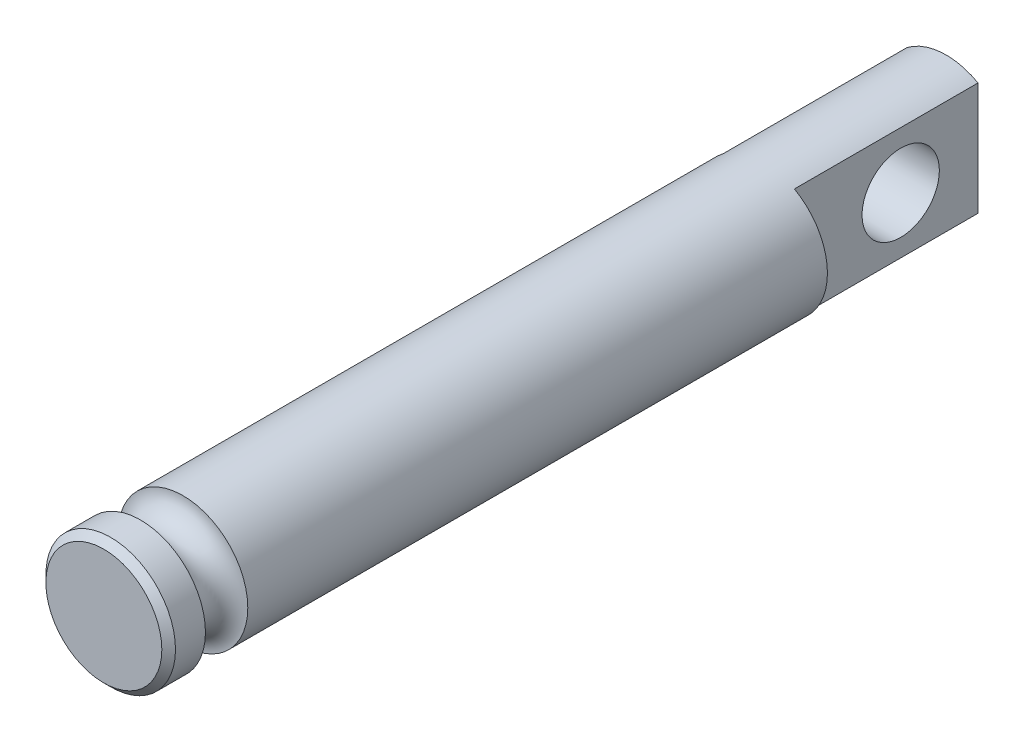
ISO-10303-21;
HEADER;
FILE_DESCRIPTION(('STEP AP214'),'2;1');
FILE_NAME('part.step','',(''),(''),'','','');
FILE_SCHEMA(('AUTOMOTIVE_DESIGN { 1 0 10303 214 1 1 1 1 }'));
ENDSEC;
DATA;
#1=APPLICATION_CONTEXT('core data for automotive mechanical design processes');
#2=APPLICATION_PROTOCOL_DEFINITION('international standard','automotive_design',2000,#1);
#3=PRODUCT_CONTEXT('',#1,'mechanical');
#4=PRODUCT('Part','Part','',(#3));
#5=PRODUCT_RELATED_PRODUCT_CATEGORY('part','',(#4));
#6=PRODUCT_DEFINITION_FORMATION('','',#4);
#7=PRODUCT_DEFINITION_CONTEXT('part definition',#1,'design');
#8=PRODUCT_DEFINITION('design','',#6,#7);
#9=PRODUCT_DEFINITION_SHAPE('','',#8);
#10=(LENGTH_UNIT() NAMED_UNIT(*) SI_UNIT(.MILLI.,.METRE.));
#11=(NAMED_UNIT(*) PLANE_ANGLE_UNIT() SI_UNIT($,.RADIAN.));
#12=(NAMED_UNIT(*) SI_UNIT($,.STERADIAN.) SOLID_ANGLE_UNIT());
#13=UNCERTAINTY_MEASURE_WITH_UNIT(LENGTH_MEASURE(1.E-05),#10,'distance_accuracy_value','');
#14=(GEOMETRIC_REPRESENTATION_CONTEXT(3) GLOBAL_UNCERTAINTY_ASSIGNED_CONTEXT((#13)) GLOBAL_UNIT_ASSIGNED_CONTEXT((#10,
#11,#12)) REPRESENTATION_CONTEXT('',''));
#15=CARTESIAN_POINT('',(0.,0.,0.));
#16=DIRECTION('',(0.,0.,1.));
#17=DIRECTION('',(1.,0.,0.));
#18=AXIS2_PLACEMENT_3D('',#15,#16,#17);
#19=CARTESIAN_POINT('',(0.,0.,-87.1911007130688));
#20=DIRECTION('',(0.,0.,1.));
#21=DIRECTION('',(1.,0.,0.));
#22=AXIS2_PLACEMENT_3D('',#19,#20,#21);
#23=PLANE('',#22);
#24=CARTESIAN_POINT('',(0.,0.,-87.1911007130688));
#25=DIRECTION('',(0.,0.,1.));
#26=DIRECTION('',(1.,0.,0.));
#27=AXIS2_PLACEMENT_3D('',#24,#25,#26);
#28=CIRCLE('',#27,6.70710678118655);
#29=CARTESIAN_POINT('',(3.29289321881345,5.8431272126945,-87.1911007130688));
#30=VERTEX_POINT('',#29);
#31=CARTESIAN_POINT('',(-4.05710678118655,5.34089561218798,-87.1911007130688));
#32=VERTEX_POINT('',#31);
#33=EDGE_CURVE('E96',#30,#32,#28,.T.);
#34=ORIENTED_EDGE('',*,*,#33,.F.);
#35=DIRECTION('',(0.,1.,0.));
#36=VECTOR('',#35,1.);
#37=CARTESIAN_POINT('',(3.29289321881345,-6.70710678118655,-87.1911007130688));
#38=LINE('',#37,#36);
#39=CARTESIAN_POINT('',(3.29289321881345,-5.8431272126945,-87.1911007130688));
#40=VERTEX_POINT('',#39);
#41=EDGE_CURVE('E59',#40,#30,#38,.T.);
#42=ORIENTED_EDGE('',*,*,#41,.F.);
#43=CARTESIAN_POINT('',(-4.05710678118655,-5.34089561218798,-87.1911007130688));
#44=VERTEX_POINT('',#43);
#45=EDGE_CURVE('E92',#44,#40,#28,.T.);
#46=ORIENTED_EDGE('',*,*,#45,.F.);
#47=DIRECTION('',(0.,1.,0.));
#48=VECTOR('',#47,1.);
#49=CARTESIAN_POINT('',(-4.05710678118655,-6.70710678118655,-87.1911007130688));
#50=LINE('',#49,#48);
#51=EDGE_CURVE('E76',#44,#32,#50,.T.);
#52=ORIENTED_EDGE('',*,*,#51,.T.);
#53=EDGE_LOOP('',(#34,#42,#46,#52));
#54=FACE_BOUND('',#53,.T.);
#55=ADVANCED_FACE('F36',(#54),#23,.F.);
#56=CARTESIAN_POINT('',(0.,0.,0.));
#57=DIRECTION('',(0.,0.,1.));
#58=DIRECTION('',(1.,0.,0.));
#59=AXIS2_PLACEMENT_3D('',#56,#57,#58);
#60=CYLINDRICAL_SURFACE('',#59,6.70710678118655);
#61=CARTESIAN_POINT('',(0.,0.,-8.19110071306884));
#62=DIRECTION('',(0.,0.,1.));
#63=DIRECTION('',(1.,0.,0.));
#64=AXIS2_PLACEMENT_3D('',#61,#62,#63);
#65=CIRCLE('',#64,6.70710678118655);
#66=CARTESIAN_POINT('',(6.70710678118655,0.,-8.19110071306884));
#67=VERTEX_POINT('',#66);
#68=EDGE_CURVE('E97',#67,#67,#65,.T.);
#69=ORIENTED_EDGE('',*,*,#68,.F.);
#70=EDGE_LOOP('',(#69));
#71=FACE_BOUND('',#70,.T.);
#72=CARTESIAN_POINT('',(0.,0.,-68.1911007130688));
#73=DIRECTION('',(0.,0.,-1.));
#74=DIRECTION('',(-1.,0.,0.));
#75=AXIS2_PLACEMENT_3D('',#72,#73,#74);
#76=CIRCLE('',#75,6.70710678118655);
#77=CARTESIAN_POINT('',(3.29289321881345,5.84312721269449,-68.1911007130688));
#78=VERTEX_POINT('',#77);
#79=CARTESIAN_POINT('',(3.29289321881345,-5.84312721269449,-68.1911007130688));
#80=VERTEX_POINT('',#79);
#81=EDGE_CURVE('E94',#78,#80,#76,.T.);
#82=ORIENTED_EDGE('',*,*,#81,.F.);
#83=DIRECTION('',(0.,0.,1.));
#84=VECTOR('',#83,1.);
#85=CARTESIAN_POINT('',(3.29289321881346,5.84312721269449,0.));
#86=LINE('',#85,#84);
#87=EDGE_CURVE('E11',#78,#30,#86,.F.);
#88=ORIENTED_EDGE('',*,*,#87,.T.);
#89=ORIENTED_EDGE('',*,*,#33,.T.);
#90=DIRECTION('',(0.,0.,1.));
#91=VECTOR('',#90,1.);
#92=CARTESIAN_POINT('',(-4.05710678118653,5.34089561218798,0.));
#93=LINE('',#92,#91);
#94=CARTESIAN_POINT('',(-4.05710678118653,5.34089561218798,-68.1911007130688));
#95=VERTEX_POINT('',#94);
#96=EDGE_CURVE('E81',#95,#32,#93,.F.);
#97=ORIENTED_EDGE('',*,*,#96,.F.);
#98=CARTESIAN_POINT('',(0.,0.,-68.1911007130688));
#99=DIRECTION('',(0.,0.,1.));
#100=DIRECTION('',(1.,0.,0.));
#101=AXIS2_PLACEMENT_3D('',#98,#99,#100);
#102=CIRCLE('',#101,6.70710678118655);
#103=CARTESIAN_POINT('',(-4.05710678118655,-5.34089561218798,-68.1911007130688));
#104=VERTEX_POINT('',#103);
#105=EDGE_CURVE('E93',#95,#104,#102,.T.);
#106=ORIENTED_EDGE('',*,*,#105,.T.);
#107=DIRECTION('',(0.,0.,1.));
#108=VECTOR('',#107,1.);
#109=CARTESIAN_POINT('',(-4.05710678118653,-5.34089561218798,0.));
#110=LINE('',#109,#108);
#111=EDGE_CURVE('E79',#44,#104,#110,.T.);
#112=ORIENTED_EDGE('',*,*,#111,.F.);
#113=ORIENTED_EDGE('',*,*,#45,.T.);
#114=DIRECTION('',(0.,0.,1.));
#115=VECTOR('',#114,1.);
#116=CARTESIAN_POINT('',(3.29289321881346,-5.84312721269449,0.));
#117=LINE('',#116,#115);
#118=EDGE_CURVE('E44',#40,#80,#117,.T.);
#119=ORIENTED_EDGE('',*,*,#118,.T.);
#120=EDGE_LOOP('',(#82,#88,#89,#97,#106,#112,#113,#119));
#121=FACE_BOUND('',#120,.T.);
#122=ADVANCED_FACE('F90',(#71,#121),#60,.T.);
#123=CARTESIAN_POINT('',(0.,0.,-6.));
#124=DIRECTION('',(0.,0.,1.));
#125=DIRECTION('',(1.,0.,0.));
#126=AXIS2_PLACEMENT_3D('',#123,#124,#125);
#127=TOROIDAL_SURFACE('',#126,6.70710678118655,2.19110071306884);
#128=CARTESIAN_POINT('',(0.,0.,-3.80889928693116));
#129=DIRECTION('',(0.,0.,1.));
#130=DIRECTION('',(1.,0.,0.));
#131=AXIS2_PLACEMENT_3D('',#128,#129,#130);
#132=CIRCLE('',#131,6.70710678118655);
#133=CARTESIAN_POINT('',(6.70710678118655,0.,-3.80889928693116));
#134=VERTEX_POINT('',#133);
#135=EDGE_CURVE('E100',#134,#134,#132,.T.);
#136=ORIENTED_EDGE('',*,*,#135,.F.);
#137=EDGE_LOOP('',(#136));
#138=FACE_BOUND('',#137,.T.);
#139=ORIENTED_EDGE('',*,*,#68,.T.);
#140=EDGE_LOOP('',(#139));
#141=FACE_BOUND('',#140,.T.);
#142=ADVANCED_FACE('F127',(#138,#141),#127,.F.);
#143=CARTESIAN_POINT('',(0.,0.,0.));
#144=DIRECTION('',(0.,0.,1.));
#145=DIRECTION('',(1.,0.,0.));
#146=AXIS2_PLACEMENT_3D('',#143,#144,#145);
#147=CYLINDRICAL_SURFACE('',#146,6.70710678118655);
#148=CARTESIAN_POINT('',(0.,0.,-0.707106781186547));
#149=DIRECTION('',(0.,0.,1.));
#150=DIRECTION('',(1.,0.,0.));
#151=AXIS2_PLACEMENT_3D('',#148,#149,#150);
#152=CIRCLE('',#151,6.70710678118655);
#153=CARTESIAN_POINT('',(6.70710678118655,0.,-0.707106781186547));
#154=VERTEX_POINT('',#153);
#155=EDGE_CURVE('E115',#154,#154,#152,.T.);
#156=ORIENTED_EDGE('',*,*,#155,.F.);
#157=EDGE_LOOP('',(#156));
#158=FACE_BOUND('',#157,.T.);
#159=ORIENTED_EDGE('',*,*,#135,.T.);
#160=EDGE_LOOP('',(#159));
#161=FACE_BOUND('',#160,.T.);
#162=ADVANCED_FACE('F125',(#158,#161),#147,.T.);
#163=CARTESIAN_POINT('',(0.,0.,-0.707106781186547));
#164=DIRECTION('',(0.,0.,-1.));
#165=DIRECTION('',(-1.,0.,0.));
#166=AXIS2_PLACEMENT_3D('',#163,#164,#165);
#167=CONICAL_SURFACE('',#166,6.70710678118655,0.785398163397451);
#168=CARTESIAN_POINT('',(0.,0.,0.));
#169=DIRECTION('',(0.,0.,1.));
#170=DIRECTION('',(1.,0.,0.));
#171=AXIS2_PLACEMENT_3D('',#168,#169,#170);
#172=CIRCLE('',#171,6.);
#173=CARTESIAN_POINT('',(6.,0.,0.));
#174=VERTEX_POINT('',#173);
#175=EDGE_CURVE('E112',#174,#174,#172,.T.);
#176=ORIENTED_EDGE('',*,*,#175,.F.);
#177=EDGE_LOOP('',(#176));
#178=FACE_BOUND('',#177,.T.);
#179=ORIENTED_EDGE('',*,*,#155,.T.);
#180=EDGE_LOOP('',(#179));
#181=FACE_BOUND('',#180,.T.);
#182=ADVANCED_FACE('F140',(#178,#181),#167,.T.);
#183=CARTESIAN_POINT('',(0.,0.,0.));
#184=DIRECTION('',(0.,0.,-1.));
#185=DIRECTION('',(-1.,0.,0.));
#186=AXIS2_PLACEMENT_3D('',#183,#184,#185);
#187=PLANE('',#186);
#188=ORIENTED_EDGE('',*,*,#175,.T.);
#189=EDGE_LOOP('',(#188));
#190=FACE_BOUND('',#189,.T.);
#191=ADVANCED_FACE('F144',(#190),#187,.F.);
#192=CARTESIAN_POINT('',(-6.70710678118655,-6.70710678118655,-68.1911007130688));
#193=DIRECTION('',(0.,0.,1.));
#194=DIRECTION('',(1.,0.,0.));
#195=AXIS2_PLACEMENT_3D('',#192,#193,#194);
#196=PLANE('',#195);
#197=DIRECTION('',(0.,1.,0.));
#198=VECTOR('',#197,1.);
#199=CARTESIAN_POINT('',(-4.05710678118655,-6.70710678118655,-68.1911007130688));
#200=LINE('',#199,#198);
#201=EDGE_CURVE('E51',#104,#95,#200,.T.);
#202=ORIENTED_EDGE('',*,*,#201,.F.);
#203=ORIENTED_EDGE('',*,*,#105,.F.);
#204=EDGE_LOOP('',(#202,#203));
#205=FACE_BOUND('',#204,.T.);
#206=ADVANCED_FACE('F148',(#205),#196,.F.);
#207=CARTESIAN_POINT('',(-4.05710678118655,-6.70710678118655,-87.1911007130688));
#208=DIRECTION('',(-1.,0.,0.));
#209=DIRECTION('',(0.,0.,1.));
#210=AXIS2_PLACEMENT_3D('',#207,#208,#209);
#211=PLANE('',#210);
#212=CARTESIAN_POINT('',(-4.05710678118655,0.,-79.1911007130688));
#213=DIRECTION('',(-1.,0.,0.));
#214=DIRECTION('',(0.,0.,1.));
#215=AXIS2_PLACEMENT_3D('',#212,#213,#214);
#216=CIRCLE('',#215,4.00000000000001);
#217=CARTESIAN_POINT('',(-4.05710678118655,0.,-83.1911007130688));
#218=VERTEX_POINT('',#217);
#219=EDGE_CURVE('E86',#218,#218,#216,.T.);
#220=ORIENTED_EDGE('',*,*,#219,.F.);
#221=EDGE_LOOP('',(#220));
#222=FACE_BOUND('',#221,.T.);
#223=ORIENTED_EDGE('',*,*,#111,.T.);
#224=ORIENTED_EDGE('',*,*,#201,.T.);
#225=ORIENTED_EDGE('',*,*,#96,.T.);
#226=ORIENTED_EDGE('',*,*,#51,.F.);
#227=EDGE_LOOP('',(#223,#224,#225,#226));
#228=FACE_BOUND('',#227,.T.);
#229=ADVANCED_FACE('F78',(#222,#228),#211,.T.);
#230=CARTESIAN_POINT('',(6.70710678118655,-6.70710678118655,-68.1911007130688));
#231=DIRECTION('',(0.,0.,-1.));
#232=DIRECTION('',(-1.,0.,0.));
#233=AXIS2_PLACEMENT_3D('',#230,#231,#232);
#234=PLANE('',#233);
#235=DIRECTION('',(0.,1.,0.));
#236=VECTOR('',#235,1.);
#237=CARTESIAN_POINT('',(3.29289321881345,-6.70710678118655,-68.1911007130688));
#238=LINE('',#237,#236);
#239=EDGE_CURVE('E110',#80,#78,#238,.T.);
#240=ORIENTED_EDGE('',*,*,#239,.T.);
#241=ORIENTED_EDGE('',*,*,#81,.T.);
#242=EDGE_LOOP('',(#240,#241));
#243=FACE_BOUND('',#242,.T.);
#244=ADVANCED_FACE('F152',(#243),#234,.T.);
#245=CARTESIAN_POINT('',(3.29289321881345,-6.70710678118655,-87.1911007130688));
#246=DIRECTION('',(-1.,0.,0.));
#247=DIRECTION('',(0.,0.,1.));
#248=AXIS2_PLACEMENT_3D('',#245,#246,#247);
#249=PLANE('',#248);
#250=CARTESIAN_POINT('',(3.29289321881345,0.,-79.1911007130688));
#251=DIRECTION('',(-1.,0.,0.));
#252=DIRECTION('',(0.,0.,1.));
#253=AXIS2_PLACEMENT_3D('',#250,#251,#252);
#254=CIRCLE('',#253,4.00000000000001);
#255=CARTESIAN_POINT('',(3.29289321881345,0.,-83.1911007130688));
#256=VERTEX_POINT('',#255);
#257=EDGE_CURVE('E39',#256,#256,#254,.T.);
#258=ORIENTED_EDGE('',*,*,#257,.T.);
#259=EDGE_LOOP('',(#258));
#260=FACE_BOUND('',#259,.T.);
#261=ORIENTED_EDGE('',*,*,#41,.T.);
#262=ORIENTED_EDGE('',*,*,#87,.F.);
#263=ORIENTED_EDGE('',*,*,#239,.F.);
#264=ORIENTED_EDGE('',*,*,#118,.F.);
#265=EDGE_LOOP('',(#261,#262,#263,#264));
#266=FACE_BOUND('',#265,.T.);
#267=ADVANCED_FACE('F108',(#260,#266),#249,.F.);
#268=CARTESIAN_POINT('',(-6.70710678118656,0.,-79.1911007130688));
#269=DIRECTION('',(1.,0.,0.));
#270=DIRECTION('',(0.,0.,-1.));
#271=AXIS2_PLACEMENT_3D('',#268,#269,#270);
#272=CYLINDRICAL_SURFACE('',#271,4.00000000000001);
#273=CARTESIAN_POINT('',(-4.05710678118655,0.,-83.1911007130688));
#274=CARTESIAN_POINT('',(-3.98054428118655,0.,-83.1911007130688));
#275=CARTESIAN_POINT('',(-3.90398178118655,0.,-83.1911007130688));
#276=CARTESIAN_POINT('',(-3.75085678118655,0.,-83.1911007130688));
#277=CARTESIAN_POINT('',(-3.67429428118655,0.,-83.1911007130688));
#278=CARTESIAN_POINT('',(-3.52116928118655,0.,-83.1911007130688));
#279=CARTESIAN_POINT('',(-3.44460678118655,0.,-83.1911007130688));
#280=CARTESIAN_POINT('',(-3.29148178118655,0.,-83.1911007130688));
#281=CARTESIAN_POINT('',(-3.21491928118655,0.,-83.1911007130688));
#282=CARTESIAN_POINT('',(-3.06179428118655,0.,-83.1911007130688));
#283=CARTESIAN_POINT('',(-2.98523178118655,0.,-83.1911007130688));
#284=CARTESIAN_POINT('',(-2.83210678118655,0.,-83.1911007130688));
#285=CARTESIAN_POINT('',(-2.75554428118655,0.,-83.1911007130688));
#286=CARTESIAN_POINT('',(-2.60241928118655,0.,-83.1911007130688));
#287=CARTESIAN_POINT('',(-2.52585678118655,0.,-83.1911007130688));
#288=CARTESIAN_POINT('',(-2.37273178118655,0.,-83.1911007130688));
#289=CARTESIAN_POINT('',(-2.29616928118655,0.,-83.1911007130688));
#290=CARTESIAN_POINT('',(-2.14304428118655,0.,-83.1911007130688));
#291=CARTESIAN_POINT('',(-2.06648178118655,0.,-83.1911007130688));
#292=CARTESIAN_POINT('',(-1.91335678118655,0.,-83.1911007130688));
#293=CARTESIAN_POINT('',(-1.83679428118655,0.,-83.1911007130688));
#294=CARTESIAN_POINT('',(-1.68366928118655,0.,-83.1911007130688));
#295=CARTESIAN_POINT('',(-1.60710678118655,0.,-83.1911007130688));
#296=CARTESIAN_POINT('',(-1.45398178118655,0.,-83.1911007130688));
#297=CARTESIAN_POINT('',(-1.37741928118655,0.,-83.1911007130688));
#298=CARTESIAN_POINT('',(-1.22429428118655,0.,-83.1911007130688));
#299=CARTESIAN_POINT('',(-1.14773178118655,0.,-83.1911007130688));
#300=CARTESIAN_POINT('',(-0.994606781186548,0.,-83.1911007130688));
#301=CARTESIAN_POINT('',(-0.918044281186548,0.,-83.1911007130688));
#302=CARTESIAN_POINT('',(-0.764919281186549,0.,-83.1911007130688));
#303=CARTESIAN_POINT('',(-0.688356781186549,0.,-83.1911007130688));
#304=CARTESIAN_POINT('',(-0.535231781186548,0.,-83.1911007130688));
#305=CARTESIAN_POINT('',(-0.458669281186548,0.,-83.1911007130688));
#306=CARTESIAN_POINT('',(-0.305544281186548,0.,-83.1911007130688));
#307=CARTESIAN_POINT('',(-0.228981781186549,0.,-83.1911007130688));
#308=CARTESIAN_POINT('',(-0.0758567811865486,0.,-83.1911007130688));
#309=CARTESIAN_POINT('',(0.000705718813451633,0.,-83.1911007130688));
#310=CARTESIAN_POINT('',(0.153830718813452,0.,-83.1911007130688));
#311=CARTESIAN_POINT('',(0.230393218813452,0.,-83.1911007130688));
#312=CARTESIAN_POINT('',(0.383518218813452,0.,-83.1911007130688));
#313=CARTESIAN_POINT('',(0.460080718813452,0.,-83.1911007130688));
#314=CARTESIAN_POINT('',(0.613205718813452,0.,-83.1911007130688));
#315=CARTESIAN_POINT('',(0.689768218813452,0.,-83.1911007130688));
#316=CARTESIAN_POINT('',(0.842893218813451,0.,-83.1911007130688));
#317=CARTESIAN_POINT('',(0.919455718813451,0.,-83.1911007130688));
#318=CARTESIAN_POINT('',(1.07258071881345,0.,-83.1911007130688));
#319=CARTESIAN_POINT('',(1.14914321881345,0.,-83.1911007130688));
#320=CARTESIAN_POINT('',(1.30226821881345,0.,-83.1911007130688));
#321=CARTESIAN_POINT('',(1.37883071881345,0.,-83.1911007130688));
#322=CARTESIAN_POINT('',(1.53195571881345,0.,-83.1911007130688));
#323=CARTESIAN_POINT('',(1.60851821881345,0.,-83.1911007130688));
#324=CARTESIAN_POINT('',(1.76164321881345,0.,-83.1911007130688));
#325=CARTESIAN_POINT('',(1.83820571881345,0.,-83.1911007130688));
#326=CARTESIAN_POINT('',(1.99133071881345,0.,-83.1911007130688));
#327=CARTESIAN_POINT('',(2.06789321881345,0.,-83.1911007130688));
#328=CARTESIAN_POINT('',(2.22101821881345,0.,-83.1911007130688));
#329=CARTESIAN_POINT('',(2.29758071881345,0.,-83.1911007130688));
#330=CARTESIAN_POINT('',(2.45070571881345,0.,-83.1911007130688));
#331=CARTESIAN_POINT('',(2.52726821881345,0.,-83.1911007130688));
#332=CARTESIAN_POINT('',(2.68039321881345,0.,-83.1911007130688));
#333=CARTESIAN_POINT('',(2.75695571881345,0.,-83.1911007130688));
#334=CARTESIAN_POINT('',(2.91008071881345,0.,-83.1911007130688));
#335=CARTESIAN_POINT('',(2.98664321881345,0.,-83.1911007130688));
#336=CARTESIAN_POINT('',(3.13976821881345,0.,-83.1911007130688));
#337=CARTESIAN_POINT('',(3.21633071881345,0.,-83.1911007130688));
#338=CARTESIAN_POINT('',(3.29289321881345,0.,-83.1911007130688));
#339=B_SPLINE_CURVE_WITH_KNOTS('',3,(#273,#274,#275,#276,#277,#278,#279,#280,#281,#282,#283,
#284,#285,#286,#287,#288,#289,#290,#291,#292,#293,#294,#295,#296,#297,#298,#299,#300,#301,#302,
#303,#304,#305,#306,#307,#308,#309,#310,#311,#312,#313,#314,#315,#316,#317,#318,#319,#320,#321,
#322,#323,#324,#325,#326,#327,#328,#329,#330,#331,#332,#333,#334,#335,#336,#337,#338),
.UNSPECIFIED.,.F.,.F.,(4,2,2,2,2,2,2,2,2,2,2,2,2,2,2,2,2,2,2,2,2,2,2,2,2,2,2,2,2,2,2,2,4),(0.,
0.2296875,0.459375,0.6890625,0.91875,1.1484375,1.378125,1.6078125,1.8375,2.0671875,2.296875,
2.5265625,2.75625,2.9859375,3.215625,3.4453125,3.675,3.9046875,4.134375,4.3640625,4.59375,
4.8234375,5.053125,5.2828125,5.5125,5.7421875,5.971875,6.2015625,6.43125,6.6609375,6.890625,
7.1203125,7.35),.UNSPECIFIED.);
#340=EDGE_CURVE('BSEAM161',#218,#256,#339,.T.);
#341=ORIENTED_EDGE('',*,*,#219,.T.);
#342=ORIENTED_EDGE('',*,*,#257,.F.);
#343=ORIENTED_EDGE('',*,*,#340,.T.);
#344=ORIENTED_EDGE('',*,*,#340,.F.);
#345=EDGE_LOOP('',(#341,#343,#342,#344));
#346=FACE_BOUND('',#345,.T.);
#347=ADVANCED_FACE('F161',(#346),#272,.F.);
#348=CLOSED_SHELL('',(#55,#122,#142,#162,#182,#191,#206,#229,#244,#267,#347));
#349=MANIFOLD_SOLID_BREP('B2',#348);
#350=ADVANCED_BREP_SHAPE_REPRESENTATION('',(#18,#349),#14);
#351=SHAPE_DEFINITION_REPRESENTATION(#9,#350);
ENDSEC;
END-ISO-10303-21;
